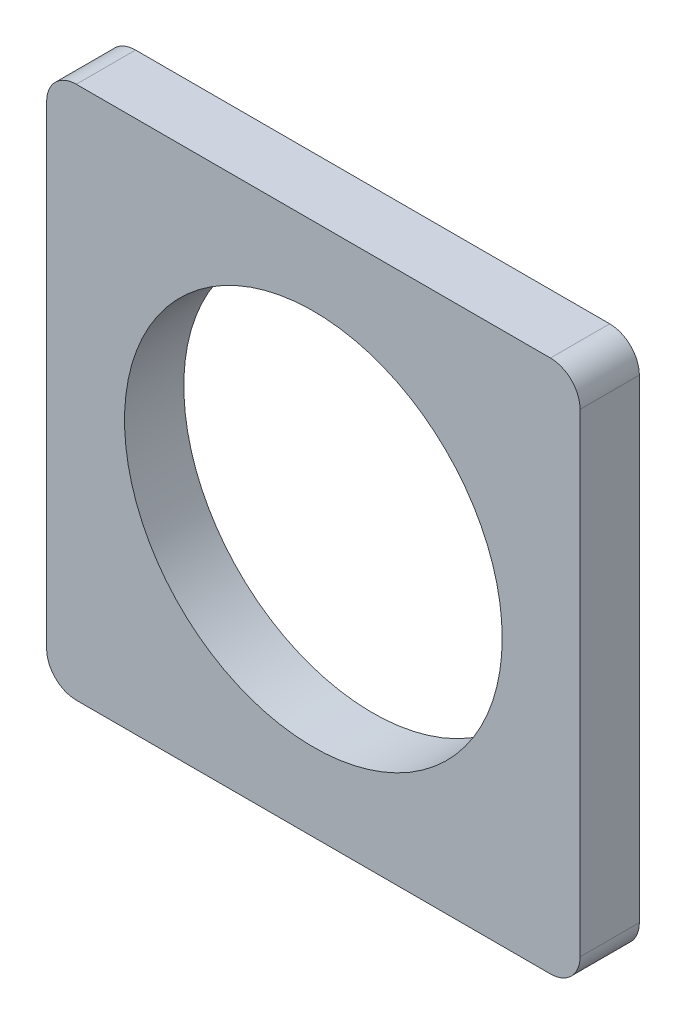
ISO-10303-21;
HEADER;
FILE_DESCRIPTION(('STEP AP214'),'2;1');
FILE_NAME('part.step','',(''),(''),'','','');
FILE_SCHEMA(('AUTOMOTIVE_DESIGN { 1 0 10303 214 1 1 1 1 }'));
ENDSEC;
DATA;
#1=APPLICATION_CONTEXT('core data for automotive mechanical design processes');
#2=APPLICATION_PROTOCOL_DEFINITION('international standard','automotive_design',2000,#1);
#3=PRODUCT_CONTEXT('',#1,'mechanical');
#4=PRODUCT('Part','Part','',(#3));
#5=PRODUCT_RELATED_PRODUCT_CATEGORY('part','',(#4));
#6=PRODUCT_DEFINITION_FORMATION('','',#4);
#7=PRODUCT_DEFINITION_CONTEXT('part definition',#1,'design');
#8=PRODUCT_DEFINITION('design','',#6,#7);
#9=PRODUCT_DEFINITION_SHAPE('','',#8);
#10=(LENGTH_UNIT() NAMED_UNIT(*) SI_UNIT(.MILLI.,.METRE.));
#11=(NAMED_UNIT(*) PLANE_ANGLE_UNIT() SI_UNIT($,.RADIAN.));
#12=(NAMED_UNIT(*) SI_UNIT($,.STERADIAN.) SOLID_ANGLE_UNIT());
#13=UNCERTAINTY_MEASURE_WITH_UNIT(LENGTH_MEASURE(1.E-05),#10,'distance_accuracy_value','');
#14=(GEOMETRIC_REPRESENTATION_CONTEXT(3) GLOBAL_UNCERTAINTY_ASSIGNED_CONTEXT((#13)) GLOBAL_UNIT_ASSIGNED_CONTEXT((#10,
#11,#12)) REPRESENTATION_CONTEXT('',''));
#15=CARTESIAN_POINT('',(0.,0.,0.));
#16=DIRECTION('',(0.,0.,1.));
#17=DIRECTION('',(1.,0.,0.));
#18=AXIS2_PLACEMENT_3D('',#15,#16,#17);
#19=CARTESIAN_POINT('',(0.,0.,6.35));
#20=DIRECTION('',(0.,0.,-1.));
#21=DIRECTION('',(-1.,0.,0.));
#22=AXIS2_PLACEMENT_3D('',#19,#20,#21);
#23=PLANE('',#22);
#24=DIRECTION('',(0.,-1.,0.));
#25=VECTOR('',#24,1.);
#26=CARTESIAN_POINT('',(79.2824744291385,-27.2926888987983,6.35));
#27=LINE('',#26,#25);
#28=CARTESIAN_POINT('',(79.2824744291385,26.6823111012017,6.35));
#29=VERTEX_POINT('',#28);
#30=CARTESIAN_POINT('',(79.2824744291385,-24.1176888987983,6.35));
#31=VERTEX_POINT('',#30);
#32=EDGE_CURVE('E164',#29,#31,#27,.T.);
#33=ORIENTED_EDGE('',*,*,#32,.T.);
#34=CARTESIAN_POINT('',(82.4574744291385,-24.1176888987983,6.35));
#35=DIRECTION('',(0.,0.,-1.));
#36=DIRECTION('',(-1.,0.,0.));
#37=AXIS2_PLACEMENT_3D('',#34,#35,#36);
#38=CIRCLE('',#37,3.175);
#39=CARTESIAN_POINT('',(82.4574744291385,-27.2926888987983,6.35));
#40=VERTEX_POINT('',#39);
#41=EDGE_CURVE('E147',#31,#40,#38,.F.);
#42=ORIENTED_EDGE('',*,*,#41,.T.);
#43=DIRECTION('',(1.,0.,0.));
#44=VECTOR('',#43,1.);
#45=CARTESIAN_POINT('',(79.2824744291385,-27.2926888987983,6.35));
#46=LINE('',#45,#44);
#47=CARTESIAN_POINT('',(133.257474429138,-27.2926888987983,6.35));
#48=VERTEX_POINT('',#47);
#49=EDGE_CURVE('E118',#40,#48,#46,.T.);
#50=ORIENTED_EDGE('',*,*,#49,.T.);
#51=CARTESIAN_POINT('',(133.257474429138,-24.1176888987983,6.35));
#52=DIRECTION('',(0.,0.,-1.));
#53=DIRECTION('',(-1.,0.,0.));
#54=AXIS2_PLACEMENT_3D('',#51,#52,#53);
#55=CIRCLE('',#54,3.175);
#56=CARTESIAN_POINT('',(136.432474429138,-24.1176888987983,6.35));
#57=VERTEX_POINT('',#56);
#58=EDGE_CURVE('E145',#48,#57,#55,.F.);
#59=ORIENTED_EDGE('',*,*,#58,.T.);
#60=DIRECTION('',(0.,1.,0.));
#61=VECTOR('',#60,1.);
#62=CARTESIAN_POINT('',(136.432474429138,-27.2926888987983,6.35));
#63=LINE('',#62,#61);
#64=CARTESIAN_POINT('',(136.432474429138,26.6823111012017,6.35));
#65=VERTEX_POINT('',#64);
#66=EDGE_CURVE('E125',#57,#65,#63,.T.);
#67=ORIENTED_EDGE('',*,*,#66,.T.);
#68=CARTESIAN_POINT('',(133.257474429138,26.6823111012017,6.35));
#69=DIRECTION('',(0.,0.,-1.));
#70=DIRECTION('',(-1.,0.,0.));
#71=AXIS2_PLACEMENT_3D('',#68,#69,#70);
#72=CIRCLE('',#71,3.175);
#73=CARTESIAN_POINT('',(133.257474429138,29.8573111012017,6.35));
#74=VERTEX_POINT('',#73);
#75=EDGE_CURVE('E53',#65,#74,#72,.F.);
#76=ORIENTED_EDGE('',*,*,#75,.T.);
#77=DIRECTION('',(-1.,0.,0.));
#78=VECTOR('',#77,1.);
#79=CARTESIAN_POINT('',(79.2824744291385,29.8573111012017,6.35));
#80=LINE('',#79,#78);
#81=CARTESIAN_POINT('',(82.4574744291385,29.8573111012017,6.35));
#82=VERTEX_POINT('',#81);
#83=EDGE_CURVE('E128',#74,#82,#80,.T.);
#84=ORIENTED_EDGE('',*,*,#83,.T.);
#85=CARTESIAN_POINT('',(82.4574744291385,26.6823111012017,6.35));
#86=DIRECTION('',(0.,0.,-1.));
#87=DIRECTION('',(-1.,0.,0.));
#88=AXIS2_PLACEMENT_3D('',#85,#86,#87);
#89=CIRCLE('',#88,3.175);
#90=EDGE_CURVE('E143',#82,#29,#89,.F.);
#91=ORIENTED_EDGE('',*,*,#90,.T.);
#92=EDGE_LOOP('',(#33,#42,#50,#59,#67,#76,#84,#91));
#93=FACE_BOUND('',#92,.T.);
#94=CARTESIAN_POINT('',(107.857474429138,1.28231110120169,6.35));
#95=DIRECTION('',(0.,0.,1.));
#96=DIRECTION('',(1.,0.,0.));
#97=AXIS2_PLACEMENT_3D('',#94,#95,#96);
#98=CIRCLE('',#97,20.2311);
#99=CARTESIAN_POINT('',(128.088574429139,1.28231110120169,6.35));
#100=VERTEX_POINT('',#99);
#101=EDGE_CURVE('E160',#100,#100,#98,.T.);
#102=ORIENTED_EDGE('',*,*,#101,.F.);
#103=EDGE_LOOP('',(#102));
#104=FACE_BOUND('',#103,.T.);
#105=ADVANCED_FACE('F33',(#93,#104),#23,.F.);
#106=CARTESIAN_POINT('',(0.,0.,0.));
#107=DIRECTION('',(0.,0.,-1.));
#108=DIRECTION('',(-1.,0.,0.));
#109=AXIS2_PLACEMENT_3D('',#106,#107,#108);
#110=PLANE('',#109);
#111=DIRECTION('',(1.,0.,0.));
#112=VECTOR('',#111,1.);
#113=CARTESIAN_POINT('',(79.2824744291385,-27.2926888987983,0.));
#114=LINE('',#113,#112);
#115=CARTESIAN_POINT('',(82.4574744291385,-27.2926888987983,0.));
#116=VERTEX_POINT('',#115);
#117=CARTESIAN_POINT('',(133.257474429138,-27.2926888987983,0.));
#118=VERTEX_POINT('',#117);
#119=EDGE_CURVE('E115',#116,#118,#114,.T.);
#120=ORIENTED_EDGE('',*,*,#119,.F.);
#121=CARTESIAN_POINT('',(82.4574744291385,-24.1176888987983,0.));
#122=DIRECTION('',(0.,0.,-1.));
#123=DIRECTION('',(-1.,0.,0.));
#124=AXIS2_PLACEMENT_3D('',#121,#122,#123);
#125=CIRCLE('',#124,3.175);
#126=CARTESIAN_POINT('',(79.2824744291385,-24.1176888987983,0.));
#127=VERTEX_POINT('',#126);
#128=EDGE_CURVE('E98',#116,#127,#125,.T.);
#129=ORIENTED_EDGE('',*,*,#128,.T.);
#130=DIRECTION('',(0.,-1.,0.));
#131=VECTOR('',#130,1.);
#132=CARTESIAN_POINT('',(79.2824744291385,-27.2926888987983,0.));
#133=LINE('',#132,#131);
#134=CARTESIAN_POINT('',(79.2824744291385,26.6823111012017,0.));
#135=VERTEX_POINT('',#134);
#136=EDGE_CURVE('E126',#135,#127,#133,.T.);
#137=ORIENTED_EDGE('',*,*,#136,.F.);
#138=CARTESIAN_POINT('',(82.4574744291385,26.6823111012017,0.));
#139=DIRECTION('',(0.,0.,-1.));
#140=DIRECTION('',(-1.,0.,0.));
#141=AXIS2_PLACEMENT_3D('',#138,#139,#140);
#142=CIRCLE('',#141,3.175);
#143=CARTESIAN_POINT('',(82.4574744291385,29.8573111012017,0.));
#144=VERTEX_POINT('',#143);
#145=EDGE_CURVE('E136',#135,#144,#142,.T.);
#146=ORIENTED_EDGE('',*,*,#145,.T.);
#147=DIRECTION('',(-1.,0.,0.));
#148=VECTOR('',#147,1.);
#149=CARTESIAN_POINT('',(79.2824744291385,29.8573111012017,0.));
#150=LINE('',#149,#148);
#151=CARTESIAN_POINT('',(133.257474429138,29.8573111012017,0.));
#152=VERTEX_POINT('',#151);
#153=EDGE_CURVE('E130',#152,#144,#150,.T.);
#154=ORIENTED_EDGE('',*,*,#153,.F.);
#155=CARTESIAN_POINT('',(133.257474429138,26.6823111012017,0.));
#156=DIRECTION('',(0.,0.,-1.));
#157=DIRECTION('',(-1.,0.,0.));
#158=AXIS2_PLACEMENT_3D('',#155,#156,#157);
#159=CIRCLE('',#158,3.175);
#160=CARTESIAN_POINT('',(136.432474429138,26.6823111012017,0.));
#161=VERTEX_POINT('',#160);
#162=EDGE_CURVE('E119',#152,#161,#159,.T.);
#163=ORIENTED_EDGE('',*,*,#162,.T.);
#164=DIRECTION('',(0.,1.,0.));
#165=VECTOR('',#164,1.);
#166=CARTESIAN_POINT('',(136.432474429138,-27.2926888987983,0.));
#167=LINE('',#166,#165);
#168=CARTESIAN_POINT('',(136.432474429138,-24.1176888987983,0.));
#169=VERTEX_POINT('',#168);
#170=EDGE_CURVE('E159',#169,#161,#167,.T.);
#171=ORIENTED_EDGE('',*,*,#170,.F.);
#172=CARTESIAN_POINT('',(133.257474429138,-24.1176888987983,0.));
#173=DIRECTION('',(0.,0.,-1.));
#174=DIRECTION('',(-1.,0.,0.));
#175=AXIS2_PLACEMENT_3D('',#172,#173,#174);
#176=CIRCLE('',#175,3.175);
#177=EDGE_CURVE('E109',#169,#118,#176,.T.);
#178=ORIENTED_EDGE('',*,*,#177,.T.);
#179=EDGE_LOOP('',(#120,#129,#137,#146,#154,#163,#171,#178));
#180=FACE_BOUND('',#179,.T.);
#181=CARTESIAN_POINT('',(107.857474429138,1.28231110120169,0.));
#182=DIRECTION('',(0.,0.,1.));
#183=DIRECTION('',(1.,0.,0.));
#184=AXIS2_PLACEMENT_3D('',#181,#182,#183);
#185=CIRCLE('',#184,20.2311);
#186=CARTESIAN_POINT('',(128.088574429139,1.28231110120169,0.));
#187=VERTEX_POINT('',#186);
#188=EDGE_CURVE('E168',#187,#187,#185,.T.);
#189=ORIENTED_EDGE('',*,*,#188,.T.);
#190=EDGE_LOOP('',(#189));
#191=FACE_BOUND('',#190,.T.);
#192=ADVANCED_FACE('F122',(#180,#191),#110,.T.);
#193=CARTESIAN_POINT('',(136.432474429138,-27.2926888987983,6.35));
#194=DIRECTION('',(-1.,0.,0.));
#195=DIRECTION('',(0.,-1.,0.));
#196=AXIS2_PLACEMENT_3D('',#193,#194,#195);
#197=PLANE('',#196);
#198=ORIENTED_EDGE('',*,*,#66,.F.);
#199=DIRECTION('',(0.,0.,-1.));
#200=VECTOR('',#199,1.);
#201=CARTESIAN_POINT('',(136.432474429138,-24.1176888987983,6.35));
#202=LINE('',#201,#200);
#203=EDGE_CURVE('E151',#57,#169,#202,.T.);
#204=ORIENTED_EDGE('',*,*,#203,.T.);
#205=ORIENTED_EDGE('',*,*,#170,.T.);
#206=DIRECTION('',(0.,0.,-1.));
#207=VECTOR('',#206,1.);
#208=CARTESIAN_POINT('',(136.432474429138,26.6823111012017,6.35));
#209=LINE('',#208,#207);
#210=EDGE_CURVE('E149',#161,#65,#209,.F.);
#211=ORIENTED_EDGE('',*,*,#210,.T.);
#212=EDGE_LOOP('',(#198,#204,#205,#211));
#213=FACE_BOUND('',#212,.T.);
#214=ADVANCED_FACE('F182',(#213),#197,.F.);
#215=CARTESIAN_POINT('',(79.2824744291385,29.8573111012017,6.35));
#216=DIRECTION('',(0.,-1.,0.));
#217=DIRECTION('',(0.,0.,-1.));
#218=AXIS2_PLACEMENT_3D('',#215,#216,#217);
#219=PLANE('',#218);
#220=ORIENTED_EDGE('',*,*,#153,.T.);
#221=DIRECTION('',(0.,0.,-1.));
#222=VECTOR('',#221,1.);
#223=CARTESIAN_POINT('',(82.4574744291385,29.8573111012017,6.35));
#224=LINE('',#223,#222);
#225=EDGE_CURVE('E11',#144,#82,#224,.F.);
#226=ORIENTED_EDGE('',*,*,#225,.T.);
#227=ORIENTED_EDGE('',*,*,#83,.F.);
#228=DIRECTION('',(0.,0.,-1.));
#229=VECTOR('',#228,1.);
#230=CARTESIAN_POINT('',(133.257474429138,29.8573111012017,6.35));
#231=LINE('',#230,#229);
#232=EDGE_CURVE('E41',#74,#152,#231,.T.);
#233=ORIENTED_EDGE('',*,*,#232,.T.);
#234=EDGE_LOOP('',(#220,#226,#227,#233));
#235=FACE_BOUND('',#234,.T.);
#236=ADVANCED_FACE('F156',(#235),#219,.F.);
#237=CARTESIAN_POINT('',(79.2824744291385,-27.2926888987983,6.35));
#238=DIRECTION('',(1.,0.,0.));
#239=DIRECTION('',(0.,0.,-1.));
#240=AXIS2_PLACEMENT_3D('',#237,#238,#239);
#241=PLANE('',#240);
#242=ORIENTED_EDGE('',*,*,#136,.T.);
#243=DIRECTION('',(0.,0.,-1.));
#244=VECTOR('',#243,1.);
#245=CARTESIAN_POINT('',(79.2824744291385,-24.1176888987983,6.35));
#246=LINE('',#245,#244);
#247=EDGE_CURVE('E103',#127,#31,#246,.F.);
#248=ORIENTED_EDGE('',*,*,#247,.T.);
#249=ORIENTED_EDGE('',*,*,#32,.F.);
#250=DIRECTION('',(0.,0.,-1.));
#251=VECTOR('',#250,1.);
#252=CARTESIAN_POINT('',(79.2824744291385,26.6823111012017,6.35));
#253=LINE('',#252,#251);
#254=EDGE_CURVE('E108',#29,#135,#253,.T.);
#255=ORIENTED_EDGE('',*,*,#254,.T.);
#256=EDGE_LOOP('',(#242,#248,#249,#255));
#257=FACE_BOUND('',#256,.T.);
#258=ADVANCED_FACE('F188',(#257),#241,.F.);
#259=CARTESIAN_POINT('',(79.2824744291385,-27.2926888987983,6.35));
#260=DIRECTION('',(0.,1.,0.));
#261=DIRECTION('',(0.,0.,1.));
#262=AXIS2_PLACEMENT_3D('',#259,#260,#261);
#263=PLANE('',#262);
#264=ORIENTED_EDGE('',*,*,#49,.F.);
#265=DIRECTION('',(0.,0.,-1.));
#266=VECTOR('',#265,1.);
#267=CARTESIAN_POINT('',(82.4574744291385,-27.2926888987983,6.35));
#268=LINE('',#267,#266);
#269=EDGE_CURVE('E102',#40,#116,#268,.T.);
#270=ORIENTED_EDGE('',*,*,#269,.T.);
#271=ORIENTED_EDGE('',*,*,#119,.T.);
#272=DIRECTION('',(0.,0.,-1.));
#273=VECTOR('',#272,1.);
#274=CARTESIAN_POINT('',(133.257474429138,-27.2926888987983,6.35));
#275=LINE('',#274,#273);
#276=EDGE_CURVE('E120',#118,#48,#275,.F.);
#277=ORIENTED_EDGE('',*,*,#276,.T.);
#278=EDGE_LOOP('',(#264,#270,#271,#277));
#279=FACE_BOUND('',#278,.T.);
#280=ADVANCED_FACE('F114',(#279),#263,.F.);
#281=CARTESIAN_POINT('',(107.857474429138,1.28231110120169,6.35));
#282=DIRECTION('',(0.,0.,-1.));
#283=DIRECTION('',(-1.,0.,0.));
#284=AXIS2_PLACEMENT_3D('',#281,#282,#283);
#285=CYLINDRICAL_SURFACE('',#284,20.2311);
#286=ORIENTED_EDGE('',*,*,#101,.T.);
#287=EDGE_LOOP('',(#286));
#288=FACE_BOUND('',#287,.T.);
#289=ORIENTED_EDGE('',*,*,#188,.F.);
#290=EDGE_LOOP('',(#289));
#291=FACE_BOUND('',#290,.T.);
#292=ADVANCED_FACE('F174',(#288,#291),#285,.F.);
#293=CARTESIAN_POINT('',(82.4574744291385,-24.1176888987983,6.35));
#294=DIRECTION('',(0.,0.,-1.));
#295=DIRECTION('',(-1.,0.,0.));
#296=AXIS2_PLACEMENT_3D('',#293,#294,#295);
#297=CYLINDRICAL_SURFACE('',#296,3.175);
#298=ORIENTED_EDGE('',*,*,#41,.F.);
#299=ORIENTED_EDGE('',*,*,#247,.F.);
#300=ORIENTED_EDGE('',*,*,#128,.F.);
#301=ORIENTED_EDGE('',*,*,#269,.F.);
#302=EDGE_LOOP('',(#298,#299,#300,#301));
#303=FACE_BOUND('',#302,.T.);
#304=ADVANCED_FACE('F101',(#303),#297,.T.);
#305=CARTESIAN_POINT('',(133.257474429138,-24.1176888987983,6.35));
#306=DIRECTION('',(0.,0.,-1.));
#307=DIRECTION('',(-1.,0.,0.));
#308=AXIS2_PLACEMENT_3D('',#305,#306,#307);
#309=CYLINDRICAL_SURFACE('',#308,3.175);
#310=ORIENTED_EDGE('',*,*,#58,.F.);
#311=ORIENTED_EDGE('',*,*,#276,.F.);
#312=ORIENTED_EDGE('',*,*,#177,.F.);
#313=ORIENTED_EDGE('',*,*,#203,.F.);
#314=EDGE_LOOP('',(#310,#311,#312,#313));
#315=FACE_BOUND('',#314,.T.);
#316=ADVANCED_FACE('F199',(#315),#309,.T.);
#317=CARTESIAN_POINT('',(82.4574744291385,26.6823111012017,6.35));
#318=DIRECTION('',(0.,0.,-1.));
#319=DIRECTION('',(-1.,0.,0.));
#320=AXIS2_PLACEMENT_3D('',#317,#318,#319);
#321=CYLINDRICAL_SURFACE('',#320,3.175);
#322=ORIENTED_EDGE('',*,*,#90,.F.);
#323=ORIENTED_EDGE('',*,*,#225,.F.);
#324=ORIENTED_EDGE('',*,*,#145,.F.);
#325=ORIENTED_EDGE('',*,*,#254,.F.);
#326=EDGE_LOOP('',(#322,#323,#324,#325));
#327=FACE_BOUND('',#326,.T.);
#328=ADVANCED_FACE('F201',(#327),#321,.T.);
#329=CARTESIAN_POINT('',(133.257474429138,26.6823111012017,6.35));
#330=DIRECTION('',(0.,0.,-1.));
#331=DIRECTION('',(-1.,0.,0.));
#332=AXIS2_PLACEMENT_3D('',#329,#330,#331);
#333=CYLINDRICAL_SURFACE('',#332,3.175);
#334=ORIENTED_EDGE('',*,*,#75,.F.);
#335=ORIENTED_EDGE('',*,*,#210,.F.);
#336=ORIENTED_EDGE('',*,*,#162,.F.);
#337=ORIENTED_EDGE('',*,*,#232,.F.);
#338=EDGE_LOOP('',(#334,#335,#336,#337));
#339=FACE_BOUND('',#338,.T.);
#340=ADVANCED_FACE('F35',(#339),#333,.T.);
#341=CLOSED_SHELL('',(#105,#192,#214,#236,#258,#280,#292,#304,#316,#328,#340));
#342=MANIFOLD_SOLID_BREP('B2',#341);
#343=ADVANCED_BREP_SHAPE_REPRESENTATION('',(#18,#342),#14);
#344=SHAPE_DEFINITION_REPRESENTATION(#9,#343);
ENDSEC;
END-ISO-10303-21;
